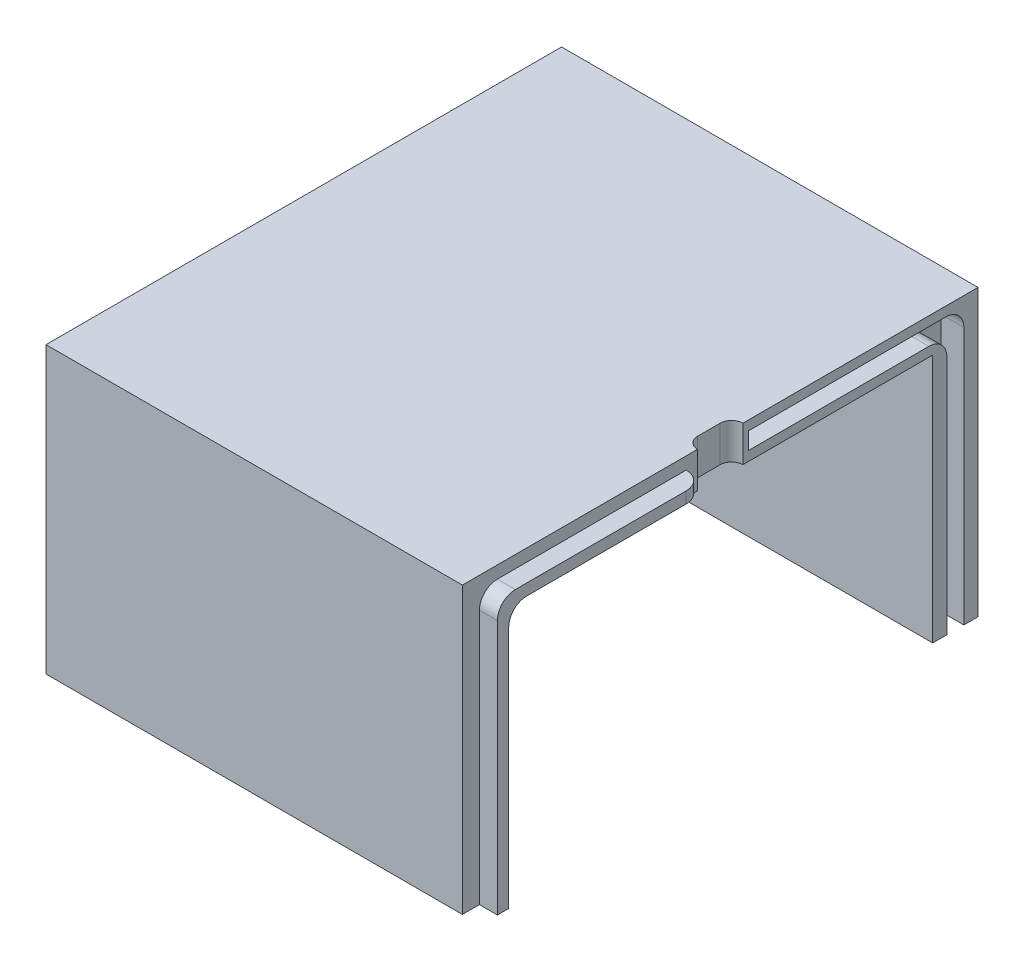
ISO-10303-21;
HEADER;
FILE_DESCRIPTION(('STEP AP214'),'2;1');
FILE_NAME('part.step','',(''),(''),'','','');
FILE_SCHEMA(('AUTOMOTIVE_DESIGN { 1 0 10303 214 1 1 1 1 }'));
ENDSEC;
DATA;
#1=APPLICATION_CONTEXT('core data for automotive mechanical design processes');
#2=APPLICATION_PROTOCOL_DEFINITION('international standard','automotive_design',2000,#1);
#3=PRODUCT_CONTEXT('',#1,'mechanical');
#4=PRODUCT('Part','Part','',(#3));
#5=PRODUCT_RELATED_PRODUCT_CATEGORY('part','',(#4));
#6=PRODUCT_DEFINITION_FORMATION('','',#4);
#7=PRODUCT_DEFINITION_CONTEXT('part definition',#1,'design');
#8=PRODUCT_DEFINITION('design','',#6,#7);
#9=PRODUCT_DEFINITION_SHAPE('','',#8);
#10=(LENGTH_UNIT() NAMED_UNIT(*) SI_UNIT(.MILLI.,.METRE.));
#11=(NAMED_UNIT(*) PLANE_ANGLE_UNIT() SI_UNIT($,.RADIAN.));
#12=(NAMED_UNIT(*) SI_UNIT($,.STERADIAN.) SOLID_ANGLE_UNIT());
#13=UNCERTAINTY_MEASURE_WITH_UNIT(LENGTH_MEASURE(1.E-05),#10,'distance_accuracy_value','');
#14=(GEOMETRIC_REPRESENTATION_CONTEXT(3) GLOBAL_UNCERTAINTY_ASSIGNED_CONTEXT((#13)) GLOBAL_UNIT_ASSIGNED_CONTEXT((#10,
#11,#12)) REPRESENTATION_CONTEXT('',''));
#15=CARTESIAN_POINT('',(0.,0.,0.));
#16=DIRECTION('',(0.,0.,1.));
#17=DIRECTION('',(1.,0.,0.));
#18=AXIS2_PLACEMENT_3D('',#15,#16,#17);
#19=CARTESIAN_POINT('',(0.,22.,0.));
#20=DIRECTION('',(1.,0.,0.));
#21=DIRECTION('',(0.,0.,-1.));
#22=AXIS2_PLACEMENT_3D('',#19,#20,#21);
#23=PLANE('',#22);
#24=DIRECTION('',(0.,-1.,0.));
#25=VECTOR('',#24,1.);
#26=CARTESIAN_POINT('',(0.,0.,2.75));
#27=LINE('',#26,#25);
#28=CARTESIAN_POINT('',(0.,21.25,2.75));
#29=VERTEX_POINT('',#28);
#30=CARTESIAN_POINT('',(0.,0.,2.75));
#31=VERTEX_POINT('',#30);
#32=EDGE_CURVE('E531',#29,#31,#27,.T.);
#33=ORIENTED_EDGE('',*,*,#32,.F.);
#34=CARTESIAN_POINT('',(0.,21.25,4.3375));
#35=DIRECTION('',(1.,0.,0.));
#36=DIRECTION('',(0.,0.,-1.));
#37=AXIS2_PLACEMENT_3D('',#34,#35,#36);
#38=CIRCLE('',#37,1.5875);
#39=CARTESIAN_POINT('',(0.,22.8375,4.3375));
#40=VERTEX_POINT('',#39);
#41=EDGE_CURVE('E430',#29,#40,#38,.T.);
#42=ORIENTED_EDGE('',*,*,#41,.T.);
#43=DIRECTION('',(0.,0.,-1.));
#44=VECTOR('',#43,1.);
#45=CARTESIAN_POINT('',(0.,22.8375,0.));
#46=LINE('',#45,#44);
#47=CARTESIAN_POINT('',(0.,22.8375,20.25));
#48=VERTEX_POINT('',#47);
#49=EDGE_CURVE('E534',#48,#40,#46,.T.);
#50=ORIENTED_EDGE('',*,*,#49,.F.);
#51=DIRECTION('',(0.,1.,0.));
#52=VECTOR('',#51,1.);
#53=CARTESIAN_POINT('',(0.,0.,20.25));
#54=LINE('',#53,#52);
#55=CARTESIAN_POINT('',(0.,24.3375,20.25));
#56=VERTEX_POINT('',#55);
#57=EDGE_CURVE('E539',#48,#56,#54,.T.);
#58=ORIENTED_EDGE('',*,*,#57,.T.);
#59=DIRECTION('',(0.,0.,-1.));
#60=VECTOR('',#59,1.);
#61=CARTESIAN_POINT('',(0.,24.3375,0.));
#62=LINE('',#61,#60);
#63=CARTESIAN_POINT('',(0.,24.3375,2.8375));
#64=VERTEX_POINT('',#63);
#65=EDGE_CURVE('E530',#56,#64,#62,.T.);
#66=ORIENTED_EDGE('',*,*,#65,.T.);
#67=CARTESIAN_POINT('',(0.,22.75,2.8375));
#68=DIRECTION('',(1.,0.,0.));
#69=DIRECTION('',(0.,0.,-1.));
#70=AXIS2_PLACEMENT_3D('',#67,#68,#69);
#71=CIRCLE('',#70,1.5875);
#72=CARTESIAN_POINT('',(0.,22.75,1.25));
#73=VERTEX_POINT('',#72);
#74=EDGE_CURVE('E457',#64,#73,#71,.F.);
#75=ORIENTED_EDGE('',*,*,#74,.T.);
#76=DIRECTION('',(0.,-1.,0.));
#77=VECTOR('',#76,1.);
#78=CARTESIAN_POINT('',(0.,0.,1.25));
#79=LINE('',#78,#77);
#80=CARTESIAN_POINT('',(0.,0.,1.25));
#81=VERTEX_POINT('',#80);
#82=EDGE_CURVE('E528',#73,#81,#79,.T.);
#83=ORIENTED_EDGE('',*,*,#82,.T.);
#84=DIRECTION('',(0.,0.,1.));
#85=VECTOR('',#84,1.);
#86=CARTESIAN_POINT('',(0.,0.,0.));
#87=LINE('',#86,#85);
#88=CARTESIAN_POINT('',(0.,0.,0.));
#89=VERTEX_POINT('',#88);
#90=EDGE_CURVE('E269',#89,#81,#87,.T.);
#91=ORIENTED_EDGE('',*,*,#90,.F.);
#92=DIRECTION('',(0.,-1.,0.));
#93=VECTOR('',#92,1.);
#94=CARTESIAN_POINT('',(0.,22.,0.));
#95=LINE('',#94,#93);
#96=CARTESIAN_POINT('',(0.,25.175,0.));
#97=VERTEX_POINT('',#96);
#98=EDGE_CURVE('E408',#97,#89,#95,.T.);
#99=ORIENTED_EDGE('',*,*,#98,.F.);
#100=DIRECTION('',(0.,0.,-1.));
#101=VECTOR('',#100,1.);
#102=CARTESIAN_POINT('',(0.,25.175,0.));
#103=LINE('',#102,#101);
#104=CARTESIAN_POINT('',(0.,25.175,20.75));
#105=VERTEX_POINT('',#104);
#106=EDGE_CURVE('E324',#105,#97,#103,.T.);
#107=ORIENTED_EDGE('',*,*,#106,.F.);
#108=DIRECTION('',(0.,-1.,0.));
#109=VECTOR('',#108,1.);
#110=CARTESIAN_POINT('',(0.,25.175,20.75));
#111=LINE('',#110,#109);
#112=CARTESIAN_POINT('',(0.,22.,20.75));
#113=VERTEX_POINT('',#112);
#114=EDGE_CURVE('E347',#105,#113,#111,.T.);
#115=ORIENTED_EDGE('',*,*,#114,.T.);
#116=DIRECTION('',(0.,0.,-1.));
#117=VECTOR('',#116,1.);
#118=CARTESIAN_POINT('',(0.,22.,0.));
#119=LINE('',#118,#117);
#120=CARTESIAN_POINT('',(0.,22.,4.));
#121=VERTEX_POINT('',#120);
#122=EDGE_CURVE('E323',#113,#121,#119,.T.);
#123=ORIENTED_EDGE('',*,*,#122,.T.);
#124=DIRECTION('',(0.,-1.,0.));
#125=VECTOR('',#124,1.);
#126=CARTESIAN_POINT('',(0.,22.,4.));
#127=LINE('',#126,#125);
#128=CARTESIAN_POINT('',(0.,0.,4.));
#129=VERTEX_POINT('',#128);
#130=EDGE_CURVE('E410',#121,#129,#127,.T.);
#131=ORIENTED_EDGE('',*,*,#130,.T.);
#132=EDGE_CURVE('E388',#31,#129,#87,.T.);
#133=ORIENTED_EDGE('',*,*,#132,.F.);
#134=EDGE_LOOP('',(#33,#42,#50,#58,#66,#75,#83,#91,#99,#107,#115,#123,#131,#133));
#135=FACE_BOUND('',#134,.T.);
#136=ADVANCED_FACE('F46',(#135),#23,.T.);
#137=CARTESIAN_POINT('',(0.,0.,0.));
#138=DIRECTION('',(0.,1.,0.));
#139=DIRECTION('',(0.,0.,1.));
#140=AXIS2_PLACEMENT_3D('',#137,#138,#139);
#141=PLANE('',#140);
#142=CARTESIAN_POINT('',(-18.375,0.,2.5));
#143=DIRECTION('',(0.,-1.,0.));
#144=DIRECTION('',(0.,0.,-1.));
#145=AXIS2_PLACEMENT_3D('',#142,#143,#144);
#146=CIRCLE('',#145,0.88899999999999);
#147=CARTESIAN_POINT('',(-18.375,0.,1.61100000000001));
#148=VERTEX_POINT('',#147);
#149=EDGE_CURVE('E317',#148,#148,#146,.T.);
#150=ORIENTED_EDGE('',*,*,#149,.F.);
#151=EDGE_LOOP('',(#150));
#152=FACE_BOUND('',#151,.T.);
#153=CARTESIAN_POINT('',(-18.375,0.,43.));
#154=DIRECTION('',(0.,-1.,0.));
#155=DIRECTION('',(0.,0.,-1.));
#156=AXIS2_PLACEMENT_3D('',#153,#154,#155);
#157=CIRCLE('',#156,0.88899999999999);
#158=CARTESIAN_POINT('',(-18.375,0.,42.111));
#159=VERTEX_POINT('',#158);
#160=EDGE_CURVE('E311',#159,#159,#157,.T.);
#161=ORIENTED_EDGE('',*,*,#160,.F.);
#162=EDGE_LOOP('',(#161));
#163=FACE_BOUND('',#162,.T.);
#164=DIRECTION('',(1.,0.,0.));
#165=VECTOR('',#164,1.);
#166=CARTESIAN_POINT('',(-2.,0.,1.25));
#167=LINE('',#166,#165);
#168=CARTESIAN_POINT('',(-2.,0.,1.25));
#169=VERTEX_POINT('',#168);
#170=EDGE_CURVE('E249',#169,#81,#167,.T.);
#171=ORIENTED_EDGE('',*,*,#170,.F.);
#172=DIRECTION('',(0.,0.,-1.));
#173=VECTOR('',#172,1.);
#174=CARTESIAN_POINT('',(-2.,0.,0.));
#175=LINE('',#174,#173);
#176=CARTESIAN_POINT('',(-2.,0.,2.75));
#177=VERTEX_POINT('',#176);
#178=EDGE_CURVE('E256',#177,#169,#175,.T.);
#179=ORIENTED_EDGE('',*,*,#178,.F.);
#180=DIRECTION('',(1.,0.,0.));
#181=VECTOR('',#180,1.);
#182=CARTESIAN_POINT('',(-2.,0.,2.75));
#183=LINE('',#182,#181);
#184=EDGE_CURVE('E271',#177,#31,#183,.T.);
#185=ORIENTED_EDGE('',*,*,#184,.T.);
#186=ORIENTED_EDGE('',*,*,#132,.T.);
#187=DIRECTION('',(-1.,0.,0.));
#188=VECTOR('',#187,1.);
#189=CARTESIAN_POINT('',(0.,0.,4.));
#190=LINE('',#189,#188);
#191=CARTESIAN_POINT('',(-32.75,0.,4.));
#192=VERTEX_POINT('',#191);
#193=EDGE_CURVE('E385',#129,#192,#190,.T.);
#194=ORIENTED_EDGE('',*,*,#193,.T.);
#195=DIRECTION('',(0.,0.,1.));
#196=VECTOR('',#195,1.);
#197=CARTESIAN_POINT('',(-32.75,0.,0.));
#198=LINE('',#197,#196);
#199=CARTESIAN_POINT('',(-32.75,0.,41.5));
#200=VERTEX_POINT('',#199);
#201=EDGE_CURVE('E382',#192,#200,#198,.T.);
#202=ORIENTED_EDGE('',*,*,#201,.T.);
#203=DIRECTION('',(1.,0.,0.));
#204=VECTOR('',#203,1.);
#205=CARTESIAN_POINT('',(0.,0.,41.5));
#206=LINE('',#205,#204);
#207=CARTESIAN_POINT('',(0.,0.,41.5));
#208=VERTEX_POINT('',#207);
#209=EDGE_CURVE('E368',#200,#208,#206,.T.);
#210=ORIENTED_EDGE('',*,*,#209,.T.);
#211=CARTESIAN_POINT('',(0.,0.,43.));
#212=VERTEX_POINT('',#211);
#213=EDGE_CURVE('E373',#208,#212,#87,.T.);
#214=ORIENTED_EDGE('',*,*,#213,.T.);
#215=DIRECTION('',(-1.,0.,0.));
#216=VECTOR('',#215,1.);
#217=CARTESIAN_POINT('',(1.5875,0.,43.));
#218=LINE('',#217,#216);
#219=CARTESIAN_POINT('',(1.5875,0.,43.));
#220=VERTEX_POINT('',#219);
#221=EDGE_CURVE('E293',#220,#212,#218,.T.);
#222=ORIENTED_EDGE('',*,*,#221,.F.);
#223=DIRECTION('',(0.,0.,-1.));
#224=VECTOR('',#223,1.);
#225=CARTESIAN_POINT('',(1.5875,0.,0.));
#226=LINE('',#225,#224);
#227=CARTESIAN_POINT('',(1.5875,0.,44.));
#228=VERTEX_POINT('',#227);
#229=EDGE_CURVE('E286',#228,#220,#226,.T.);
#230=ORIENTED_EDGE('',*,*,#229,.F.);
#231=DIRECTION('',(-1.,0.,0.));
#232=VECTOR('',#231,1.);
#233=CARTESIAN_POINT('',(1.5875,0.,44.));
#234=LINE('',#233,#232);
#235=CARTESIAN_POINT('',(0.,0.,44.));
#236=VERTEX_POINT('',#235);
#237=EDGE_CURVE('E308',#228,#236,#234,.T.);
#238=ORIENTED_EDGE('',*,*,#237,.T.);
#239=CARTESIAN_POINT('',(0.,0.,45.5));
#240=VERTEX_POINT('',#239);
#241=EDGE_CURVE('E398',#236,#240,#87,.T.);
#242=ORIENTED_EDGE('',*,*,#241,.T.);
#243=DIRECTION('',(-1.,0.,0.));
#244=VECTOR('',#243,1.);
#245=CARTESIAN_POINT('',(0.,0.,45.5));
#246=LINE('',#245,#244);
#247=CARTESIAN_POINT('',(-36.75,0.,45.5));
#248=VERTEX_POINT('',#247);
#249=EDGE_CURVE('E395',#240,#248,#246,.T.);
#250=ORIENTED_EDGE('',*,*,#249,.T.);
#251=DIRECTION('',(0.,0.,1.));
#252=VECTOR('',#251,1.);
#253=CARTESIAN_POINT('',(-36.75,0.,0.));
#254=LINE('',#253,#252);
#255=CARTESIAN_POINT('',(-36.75,0.,0.));
#256=VERTEX_POINT('',#255);
#257=EDGE_CURVE('E392',#256,#248,#254,.T.);
#258=ORIENTED_EDGE('',*,*,#257,.F.);
#259=DIRECTION('',(-1.,0.,0.));
#260=VECTOR('',#259,1.);
#261=CARTESIAN_POINT('',(0.,0.,0.));
#262=LINE('',#261,#260);
#263=EDGE_CURVE('E390',#89,#256,#262,.T.);
#264=ORIENTED_EDGE('',*,*,#263,.F.);
#265=ORIENTED_EDGE('',*,*,#90,.T.);
#266=EDGE_LOOP('',(#171,#179,#185,#186,#194,#202,#210,#214,#222,#230,#238,#242,#250,#258,#264,#265));
#267=FACE_BOUND('',#266,.T.);
#268=ADVANCED_FACE('F266',(#152,#163,#267),#141,.F.);
#269=CARTESIAN_POINT('',(0.,22.,41.5));
#270=DIRECTION('',(0.,0.,-1.));
#271=DIRECTION('',(-1.,0.,0.));
#272=AXIS2_PLACEMENT_3D('',#269,#270,#271);
#273=PLANE('',#272);
#274=ORIENTED_EDGE('',*,*,#209,.F.);
#275=DIRECTION('',(0.,-1.,0.));
#276=VECTOR('',#275,1.);
#277=CARTESIAN_POINT('',(-32.75,22.,41.5));
#278=LINE('',#277,#276);
#279=CARTESIAN_POINT('',(-32.75,22.,41.5));
#280=VERTEX_POINT('',#279);
#281=EDGE_CURVE('E415',#280,#200,#278,.T.);
#282=ORIENTED_EDGE('',*,*,#281,.F.);
#283=DIRECTION('',(1.,0.,0.));
#284=VECTOR('',#283,1.);
#285=CARTESIAN_POINT('',(0.,22.,41.5));
#286=LINE('',#285,#284);
#287=CARTESIAN_POINT('',(0.,22.,41.5));
#288=VERTEX_POINT('',#287);
#289=EDGE_CURVE('E369',#280,#288,#286,.T.);
#290=ORIENTED_EDGE('',*,*,#289,.T.);
#291=DIRECTION('',(0.,-1.,0.));
#292=VECTOR('',#291,1.);
#293=CARTESIAN_POINT('',(0.,22.,41.5));
#294=LINE('',#293,#292);
#295=EDGE_CURVE('E379',#288,#208,#294,.T.);
#296=ORIENTED_EDGE('',*,*,#295,.T.);
#297=EDGE_LOOP('',(#274,#282,#290,#296));
#298=FACE_BOUND('',#297,.T.);
#299=ADVANCED_FACE('F498',(#298),#273,.T.);
#300=CARTESIAN_POINT('',(-32.75,22.,0.));
#301=DIRECTION('',(1.,0.,0.));
#302=DIRECTION('',(0.,0.,-1.));
#303=AXIS2_PLACEMENT_3D('',#300,#301,#302);
#304=PLANE('',#303);
#305=ORIENTED_EDGE('',*,*,#201,.F.);
#306=DIRECTION('',(0.,-1.,0.));
#307=VECTOR('',#306,1.);
#308=CARTESIAN_POINT('',(-32.75,22.,4.));
#309=LINE('',#308,#307);
#310=CARTESIAN_POINT('',(-32.75,22.,4.));
#311=VERTEX_POINT('',#310);
#312=EDGE_CURVE('E413',#311,#192,#309,.T.);
#313=ORIENTED_EDGE('',*,*,#312,.F.);
#314=DIRECTION('',(0.,0.,1.));
#315=VECTOR('',#314,1.);
#316=CARTESIAN_POINT('',(-32.75,22.,0.));
#317=LINE('',#316,#315);
#318=EDGE_CURVE('E372',#311,#280,#317,.T.);
#319=ORIENTED_EDGE('',*,*,#318,.T.);
#320=ORIENTED_EDGE('',*,*,#281,.T.);
#321=EDGE_LOOP('',(#305,#313,#319,#320));
#322=FACE_BOUND('',#321,.T.);
#323=ADVANCED_FACE('F495',(#322),#304,.T.);
#324=CARTESIAN_POINT('',(0.,22.,4.));
#325=DIRECTION('',(0.,0.,1.));
#326=DIRECTION('',(1.,0.,0.));
#327=AXIS2_PLACEMENT_3D('',#324,#325,#326);
#328=PLANE('',#327);
#329=ORIENTED_EDGE('',*,*,#193,.F.);
#330=ORIENTED_EDGE('',*,*,#130,.F.);
#331=DIRECTION('',(-1.,0.,0.));
#332=VECTOR('',#331,1.);
#333=CARTESIAN_POINT('',(0.,22.,4.));
#334=LINE('',#333,#332);
#335=EDGE_CURVE('E376',#121,#311,#334,.T.);
#336=ORIENTED_EDGE('',*,*,#335,.T.);
#337=ORIENTED_EDGE('',*,*,#312,.T.);
#338=EDGE_LOOP('',(#329,#330,#336,#337));
#339=FACE_BOUND('',#338,.T.);
#340=ADVANCED_FACE('F491',(#339),#328,.T.);
#341=CARTESIAN_POINT('',(0.,22.,0.));
#342=DIRECTION('',(0.,0.,1.));
#343=DIRECTION('',(1.,0.,0.));
#344=AXIS2_PLACEMENT_3D('',#341,#342,#343);
#345=PLANE('',#344);
#346=ORIENTED_EDGE('',*,*,#263,.T.);
#347=DIRECTION('',(0.,-1.,0.));
#348=VECTOR('',#347,1.);
#349=CARTESIAN_POINT('',(-36.75,22.,0.));
#350=LINE('',#349,#348);
#351=CARTESIAN_POINT('',(-36.75,25.175,0.));
#352=VERTEX_POINT('',#351);
#353=EDGE_CURVE('E405',#352,#256,#350,.T.);
#354=ORIENTED_EDGE('',*,*,#353,.F.);
#355=DIRECTION('',(1.,0.,0.));
#356=VECTOR('',#355,1.);
#357=CARTESIAN_POINT('',(0.,25.175,0.));
#358=LINE('',#357,#356);
#359=EDGE_CURVE('E327',#352,#97,#358,.T.);
#360=ORIENTED_EDGE('',*,*,#359,.T.);
#361=ORIENTED_EDGE('',*,*,#98,.T.);
#362=EDGE_LOOP('',(#346,#354,#360,#361));
#363=FACE_BOUND('',#362,.T.);
#364=ADVANCED_FACE('F526',(#363),#345,.F.);
#365=CARTESIAN_POINT('',(-36.75,22.,0.));
#366=DIRECTION('',(1.,0.,0.));
#367=DIRECTION('',(0.,0.,-1.));
#368=AXIS2_PLACEMENT_3D('',#365,#366,#367);
#369=PLANE('',#368);
#370=ORIENTED_EDGE('',*,*,#257,.T.);
#371=DIRECTION('',(0.,-1.,0.));
#372=VECTOR('',#371,1.);
#373=CARTESIAN_POINT('',(-36.75,22.,45.5));
#374=LINE('',#373,#372);
#375=CARTESIAN_POINT('',(-36.75,25.175,45.5));
#376=VERTEX_POINT('',#375);
#377=EDGE_CURVE('E403',#376,#248,#374,.T.);
#378=ORIENTED_EDGE('',*,*,#377,.F.);
#379=DIRECTION('',(0.,0.,-1.));
#380=VECTOR('',#379,1.);
#381=CARTESIAN_POINT('',(-36.75,25.175,0.));
#382=LINE('',#381,#380);
#383=EDGE_CURVE('E331',#376,#352,#382,.T.);
#384=ORIENTED_EDGE('',*,*,#383,.T.);
#385=ORIENTED_EDGE('',*,*,#353,.T.);
#386=EDGE_LOOP('',(#370,#378,#384,#385));
#387=FACE_BOUND('',#386,.T.);
#388=ADVANCED_FACE('F523',(#387),#369,.F.);
#389=CARTESIAN_POINT('',(0.,22.,45.5));
#390=DIRECTION('',(0.,0.,1.));
#391=DIRECTION('',(1.,0.,0.));
#392=AXIS2_PLACEMENT_3D('',#389,#390,#391);
#393=PLANE('',#392);
#394=ORIENTED_EDGE('',*,*,#249,.F.);
#395=DIRECTION('',(0.,-1.,0.));
#396=VECTOR('',#395,1.);
#397=CARTESIAN_POINT('',(0.,22.,45.5));
#398=LINE('',#397,#396);
#399=CARTESIAN_POINT('',(0.,25.175,45.5));
#400=VERTEX_POINT('',#399);
#401=EDGE_CURVE('E400',#400,#240,#398,.T.);
#402=ORIENTED_EDGE('',*,*,#401,.F.);
#403=DIRECTION('',(1.,0.,0.));
#404=VECTOR('',#403,1.);
#405=CARTESIAN_POINT('',(0.,25.175,45.5));
#406=LINE('',#405,#404);
#407=EDGE_CURVE('E334',#376,#400,#406,.T.);
#408=ORIENTED_EDGE('',*,*,#407,.F.);
#409=ORIENTED_EDGE('',*,*,#377,.T.);
#410=EDGE_LOOP('',(#394,#402,#408,#409));
#411=FACE_BOUND('',#410,.T.);
#412=ADVANCED_FACE('F520',(#411),#393,.T.);
#413=DIRECTION('',(0.,0.,-1.));
#414=VECTOR('',#413,1.);
#415=CARTESIAN_POINT('',(0.,23.0875,0.));
#416=LINE('',#415,#414);
#417=CARTESIAN_POINT('',(0.,23.0875,41.4125));
#418=VERTEX_POINT('',#417);
#419=CARTESIAN_POINT('',(0.,23.0875,25.75));
#420=VERTEX_POINT('',#419);
#421=EDGE_CURVE('E283',#418,#420,#416,.T.);
#422=ORIENTED_EDGE('',*,*,#421,.F.);
#423=CARTESIAN_POINT('',(0.,21.5,41.4125));
#424=DIRECTION('',(1.,0.,0.));
#425=DIRECTION('',(0.,0.,-1.));
#426=AXIS2_PLACEMENT_3D('',#423,#424,#425);
#427=CIRCLE('',#426,1.5875);
#428=CARTESIAN_POINT('',(0.,21.5,43.));
#429=VERTEX_POINT('',#428);
#430=EDGE_CURVE('E444',#418,#429,#427,.T.);
#431=ORIENTED_EDGE('',*,*,#430,.T.);
#432=DIRECTION('',(0.,1.,0.));
#433=VECTOR('',#432,1.);
#434=CARTESIAN_POINT('',(0.,0.,43.));
#435=LINE('',#434,#433);
#436=EDGE_CURVE('E302',#212,#429,#435,.T.);
#437=ORIENTED_EDGE('',*,*,#436,.F.);
#438=ORIENTED_EDGE('',*,*,#213,.F.);
#439=ORIENTED_EDGE('',*,*,#295,.F.);
#440=DIRECTION('',(0.,0.,-1.));
#441=VECTOR('',#440,1.);
#442=CARTESIAN_POINT('',(0.,22.,0.));
#443=LINE('',#442,#441);
#444=CARTESIAN_POINT('',(0.,22.,24.75));
#445=VERTEX_POINT('',#444);
#446=EDGE_CURVE('E350',#288,#445,#443,.T.);
#447=ORIENTED_EDGE('',*,*,#446,.T.);
#448=DIRECTION('',(0.,-1.,0.));
#449=VECTOR('',#448,1.);
#450=CARTESIAN_POINT('',(0.,25.175,24.75));
#451=LINE('',#450,#449);
#452=CARTESIAN_POINT('',(0.,25.175,24.75));
#453=VERTEX_POINT('',#452);
#454=EDGE_CURVE('E365',#453,#445,#451,.T.);
#455=ORIENTED_EDGE('',*,*,#454,.F.);
#456=DIRECTION('',(0.,0.,-1.));
#457=VECTOR('',#456,1.);
#458=CARTESIAN_POINT('',(0.,25.175,0.));
#459=LINE('',#458,#457);
#460=EDGE_CURVE('E337',#400,#453,#459,.T.);
#461=ORIENTED_EDGE('',*,*,#460,.F.);
#462=ORIENTED_EDGE('',*,*,#401,.T.);
#463=ORIENTED_EDGE('',*,*,#241,.F.);
#464=DIRECTION('',(0.,1.,0.));
#465=VECTOR('',#464,1.);
#466=CARTESIAN_POINT('',(0.,0.,44.));
#467=LINE('',#466,#465);
#468=CARTESIAN_POINT('',(0.,22.5,44.));
#469=VERTEX_POINT('',#468);
#470=EDGE_CURVE('E299',#236,#469,#467,.T.);
#471=ORIENTED_EDGE('',*,*,#470,.T.);
#472=CARTESIAN_POINT('',(0.,22.5,42.4125));
#473=DIRECTION('',(1.,0.,0.));
#474=DIRECTION('',(0.,0.,-1.));
#475=AXIS2_PLACEMENT_3D('',#472,#473,#474);
#476=CIRCLE('',#475,1.5875);
#477=CARTESIAN_POINT('',(0.,24.0875,42.4125));
#478=VERTEX_POINT('',#477);
#479=EDGE_CURVE('E11',#469,#478,#476,.F.);
#480=ORIENTED_EDGE('',*,*,#479,.T.);
#481=DIRECTION('',(0.,0.,-1.));
#482=VECTOR('',#481,1.);
#483=CARTESIAN_POINT('',(0.,24.0875,0.));
#484=LINE('',#483,#482);
#485=CARTESIAN_POINT('',(0.,24.0875,25.75));
#486=VERTEX_POINT('',#485);
#487=EDGE_CURVE('E296',#478,#486,#484,.T.);
#488=ORIENTED_EDGE('',*,*,#487,.T.);
#489=DIRECTION('',(0.,-1.,0.));
#490=VECTOR('',#489,1.);
#491=CARTESIAN_POINT('',(0.,0.,25.75));
#492=LINE('',#491,#490);
#493=EDGE_CURVE('E273',#486,#420,#492,.T.);
#494=ORIENTED_EDGE('',*,*,#493,.T.);
#495=EDGE_LOOP('',(#422,#431,#437,#438,#439,#447,#455,#461,#462,#463,#471,#480,#488,#494));
#496=FACE_BOUND('',#495,.T.);
#497=ADVANCED_FACE('F473',(#496),#23,.T.);
#498=CARTESIAN_POINT('',(0.,25.175,23.75));
#499=DIRECTION('',(0.,-1.,0.));
#500=DIRECTION('',(0.,0.,-1.));
#501=AXIS2_PLACEMENT_3D('',#498,#499,#500);
#502=CYLINDRICAL_SURFACE('',#501,0.999999999999995);
#503=CARTESIAN_POINT('',(0.,22.,23.75));
#504=DIRECTION('',(0.,1.,0.));
#505=DIRECTION('',(0.,0.,1.));
#506=AXIS2_PLACEMENT_3D('',#503,#504,#505);
#507=CIRCLE('',#506,0.999999999999995);
#508=CARTESIAN_POINT('',(-0.999999999999992,22.,23.75));
#509=VERTEX_POINT('',#508);
#510=EDGE_CURVE('E352',#509,#445,#507,.T.);
#511=ORIENTED_EDGE('',*,*,#510,.F.);
#512=DIRECTION('',(0.,-1.,0.));
#513=VECTOR('',#512,1.);
#514=CARTESIAN_POINT('',(-0.999999999999992,25.175,23.75));
#515=LINE('',#514,#513);
#516=CARTESIAN_POINT('',(-0.999999999999992,25.175,23.75));
#517=VERTEX_POINT('',#516);
#518=EDGE_CURVE('E363',#517,#509,#515,.T.);
#519=ORIENTED_EDGE('',*,*,#518,.F.);
#520=CARTESIAN_POINT('',(0.,25.175,23.75));
#521=DIRECTION('',(0.,1.,0.));
#522=DIRECTION('',(0.,0.,1.));
#523=AXIS2_PLACEMENT_3D('',#520,#521,#522);
#524=CIRCLE('',#523,0.999999999999995);
#525=EDGE_CURVE('E339',#517,#453,#524,.T.);
#526=ORIENTED_EDGE('',*,*,#525,.T.);
#527=ORIENTED_EDGE('',*,*,#454,.T.);
#528=EDGE_LOOP('',(#511,#519,#526,#527));
#529=FACE_BOUND('',#528,.T.);
#530=ADVANCED_FACE('F504',(#529),#502,.F.);
#531=CARTESIAN_POINT('',(-0.999999999999997,25.175,0.));
#532=DIRECTION('',(-1.,0.,0.));
#533=DIRECTION('',(0.,0.,1.));
#534=AXIS2_PLACEMENT_3D('',#531,#532,#533);
#535=PLANE('',#534);
#536=DIRECTION('',(0.,0.,-1.));
#537=VECTOR('',#536,1.);
#538=CARTESIAN_POINT('',(-0.999999999999997,22.,0.));
#539=LINE('',#538,#537);
#540=CARTESIAN_POINT('',(-0.999999999999998,22.,21.75));
#541=VERTEX_POINT('',#540);
#542=EDGE_CURVE('E355',#509,#541,#539,.T.);
#543=ORIENTED_EDGE('',*,*,#542,.T.);
#544=DIRECTION('',(0.,-1.,0.));
#545=VECTOR('',#544,1.);
#546=CARTESIAN_POINT('',(-0.999999999999998,25.175,21.75));
#547=LINE('',#546,#545);
#548=CARTESIAN_POINT('',(-0.999999999999998,25.175,21.75));
#549=VERTEX_POINT('',#548);
#550=EDGE_CURVE('E361',#549,#541,#547,.T.);
#551=ORIENTED_EDGE('',*,*,#550,.F.);
#552=DIRECTION('',(0.,0.,-1.));
#553=VECTOR('',#552,1.);
#554=CARTESIAN_POINT('',(-0.999999999999997,25.175,0.));
#555=LINE('',#554,#553);
#556=EDGE_CURVE('E342',#517,#549,#555,.T.);
#557=ORIENTED_EDGE('',*,*,#556,.F.);
#558=ORIENTED_EDGE('',*,*,#518,.T.);
#559=EDGE_LOOP('',(#543,#551,#557,#558));
#560=FACE_BOUND('',#559,.T.);
#561=ADVANCED_FACE('F511',(#560),#535,.F.);
#562=CARTESIAN_POINT('',(0.,25.175,21.75));
#563=DIRECTION('',(0.,-1.,0.));
#564=DIRECTION('',(0.,0.,-1.));
#565=AXIS2_PLACEMENT_3D('',#562,#563,#564);
#566=CYLINDRICAL_SURFACE('',#565,0.999999999999995);
#567=CARTESIAN_POINT('',(0.,22.,21.75));
#568=DIRECTION('',(0.,1.,0.));
#569=DIRECTION('',(0.,0.,1.));
#570=AXIS2_PLACEMENT_3D('',#567,#568,#569);
#571=CIRCLE('',#570,0.999999999999995);
#572=EDGE_CURVE('E328',#113,#541,#571,.T.);
#573=ORIENTED_EDGE('',*,*,#572,.F.);
#574=ORIENTED_EDGE('',*,*,#114,.F.);
#575=CARTESIAN_POINT('',(0.,25.175,21.75));
#576=DIRECTION('',(0.,1.,0.));
#577=DIRECTION('',(0.,0.,1.));
#578=AXIS2_PLACEMENT_3D('',#575,#576,#577);
#579=CIRCLE('',#578,0.999999999999995);
#580=EDGE_CURVE('E344',#105,#549,#579,.T.);
#581=ORIENTED_EDGE('',*,*,#580,.T.);
#582=ORIENTED_EDGE('',*,*,#550,.T.);
#583=EDGE_LOOP('',(#573,#574,#581,#582));
#584=FACE_BOUND('',#583,.T.);
#585=ADVANCED_FACE('F659',(#584),#566,.F.);
#586=CARTESIAN_POINT('',(0.,25.175,23.75));
#587=DIRECTION('',(0.,1.,0.));
#588=DIRECTION('',(0.,0.,1.));
#589=AXIS2_PLACEMENT_3D('',#586,#587,#588);
#590=PLANE('',#589);
#591=ORIENTED_EDGE('',*,*,#106,.T.);
#592=ORIENTED_EDGE('',*,*,#359,.F.);
#593=ORIENTED_EDGE('',*,*,#383,.F.);
#594=ORIENTED_EDGE('',*,*,#407,.T.);
#595=ORIENTED_EDGE('',*,*,#460,.T.);
#596=ORIENTED_EDGE('',*,*,#525,.F.);
#597=ORIENTED_EDGE('',*,*,#556,.T.);
#598=ORIENTED_EDGE('',*,*,#580,.F.);
#599=EDGE_LOOP('',(#591,#592,#593,#594,#595,#596,#597,#598));
#600=FACE_BOUND('',#599,.T.);
#601=ADVANCED_FACE('F515',(#600),#590,.T.);
#602=CARTESIAN_POINT('',(0.,22.,23.75));
#603=DIRECTION('',(0.,1.,0.));
#604=DIRECTION('',(0.,0.,1.));
#605=AXIS2_PLACEMENT_3D('',#602,#603,#604);
#606=PLANE('',#605);
#607=ORIENTED_EDGE('',*,*,#289,.F.);
#608=ORIENTED_EDGE('',*,*,#318,.F.);
#609=ORIENTED_EDGE('',*,*,#335,.F.);
#610=ORIENTED_EDGE('',*,*,#122,.F.);
#611=ORIENTED_EDGE('',*,*,#572,.T.);
#612=ORIENTED_EDGE('',*,*,#542,.F.);
#613=ORIENTED_EDGE('',*,*,#510,.T.);
#614=ORIENTED_EDGE('',*,*,#446,.F.);
#615=EDGE_LOOP('',(#607,#608,#609,#610,#611,#612,#613,#614));
#616=FACE_BOUND('',#615,.T.);
#617=ADVANCED_FACE('F507',(#616),#606,.F.);
#618=CARTESIAN_POINT('',(-18.375,5.73,2.5));
#619=DIRECTION('',(0.,-1.,0.));
#620=DIRECTION('',(0.,0.,-1.));
#621=AXIS2_PLACEMENT_3D('',#618,#619,#620);
#622=CONICAL_SURFACE('',#621,0.888999999999997,1.02974425867665);
#623=CARTESIAN_POINT('',(-18.375,6.2641650903155,2.5));
#624=VERTEX_POINT('',#623);
#625=VERTEX_LOOP('',#624);
#626=FACE_BOUND('',#625,.T.);
#627=CARTESIAN_POINT('',(-18.375,5.73,2.5));
#628=DIRECTION('',(0.,-1.,0.));
#629=DIRECTION('',(0.,0.,-1.));
#630=AXIS2_PLACEMENT_3D('',#627,#628,#629);
#631=CIRCLE('',#630,0.888999999999997);
#632=CARTESIAN_POINT('',(-18.375,5.73,1.61100000000001));
#633=VERTEX_POINT('',#632);
#634=EDGE_CURVE('E320',#633,#633,#631,.T.);
#635=ORIENTED_EDGE('',*,*,#634,.T.);
#636=EDGE_LOOP('',(#635));
#637=FACE_BOUND('',#636,.T.);
#638=ADVANCED_FACE('F652',(#626,#637),#622,.F.);
#639=CARTESIAN_POINT('',(-18.375,0.,2.5));
#640=DIRECTION('',(0.,-1.,0.));
#641=DIRECTION('',(0.,0.,-1.));
#642=AXIS2_PLACEMENT_3D('',#639,#640,#641);
#643=CYLINDRICAL_SURFACE('',#642,0.888999999999994);
#644=ORIENTED_EDGE('',*,*,#634,.F.);
#645=EDGE_LOOP('',(#644));
#646=FACE_BOUND('',#645,.T.);
#647=ORIENTED_EDGE('',*,*,#149,.T.);
#648=EDGE_LOOP('',(#647));
#649=FACE_BOUND('',#648,.T.);
#650=ADVANCED_FACE('F648',(#646,#649),#643,.F.);
#651=CARTESIAN_POINT('',(-18.375,5.73,43.));
#652=DIRECTION('',(0.,-1.,0.));
#653=DIRECTION('',(0.,0.,-1.));
#654=AXIS2_PLACEMENT_3D('',#651,#652,#653);
#655=CONICAL_SURFACE('',#654,0.888999999999997,1.02974425867665);
#656=CARTESIAN_POINT('',(-18.375,6.2641650903155,43.));
#657=VERTEX_POINT('',#656);
#658=VERTEX_LOOP('',#657);
#659=FACE_BOUND('',#658,.T.);
#660=CARTESIAN_POINT('',(-18.375,5.73,43.));
#661=DIRECTION('',(0.,-1.,0.));
#662=DIRECTION('',(0.,0.,-1.));
#663=AXIS2_PLACEMENT_3D('',#660,#661,#662);
#664=CIRCLE('',#663,0.888999999999997);
#665=CARTESIAN_POINT('',(-18.375,5.73,42.111));
#666=VERTEX_POINT('',#665);
#667=EDGE_CURVE('E314',#666,#666,#664,.T.);
#668=ORIENTED_EDGE('',*,*,#667,.T.);
#669=EDGE_LOOP('',(#668));
#670=FACE_BOUND('',#669,.T.);
#671=ADVANCED_FACE('F644',(#659,#670),#655,.F.);
#672=CARTESIAN_POINT('',(-18.375,0.,43.));
#673=DIRECTION('',(0.,-1.,0.));
#674=DIRECTION('',(0.,0.,-1.));
#675=AXIS2_PLACEMENT_3D('',#672,#673,#674);
#676=CYLINDRICAL_SURFACE('',#675,0.888999999999994);
#677=ORIENTED_EDGE('',*,*,#667,.F.);
#678=EDGE_LOOP('',(#677));
#679=FACE_BOUND('',#678,.T.);
#680=ORIENTED_EDGE('',*,*,#160,.T.);
#681=EDGE_LOOP('',(#680));
#682=FACE_BOUND('',#681,.T.);
#683=ADVANCED_FACE('F641',(#679,#682),#676,.F.);
#684=CARTESIAN_POINT('',(1.5875,24.0875,0.));
#685=DIRECTION('',(0.,1.,0.));
#686=DIRECTION('',(0.,0.,1.));
#687=AXIS2_PLACEMENT_3D('',#684,#685,#686);
#688=PLANE('',#687);
#689=ORIENTED_EDGE('',*,*,#487,.F.);
#690=DIRECTION('',(-1.,0.,0.));
#691=VECTOR('',#690,1.);
#692=CARTESIAN_POINT('',(1.5875,24.0875,42.4125));
#693=LINE('',#692,#691);
#694=CARTESIAN_POINT('',(1.5875,24.0875,42.4125));
#695=VERTEX_POINT('',#694);
#696=EDGE_CURVE('E68',#478,#695,#693,.F.);
#697=ORIENTED_EDGE('',*,*,#696,.T.);
#698=DIRECTION('',(0.,0.,-1.));
#699=VECTOR('',#698,1.);
#700=CARTESIAN_POINT('',(1.5875,24.0875,0.));
#701=LINE('',#700,#699);
#702=CARTESIAN_POINT('',(1.5875,24.0875,27.3375));
#703=VERTEX_POINT('',#702);
#704=EDGE_CURVE('E280',#695,#703,#701,.T.);
#705=ORIENTED_EDGE('',*,*,#704,.T.);
#706=CARTESIAN_POINT('',(0.,24.0875,27.3375));
#707=DIRECTION('',(0.,1.,0.));
#708=DIRECTION('',(0.,0.,1.));
#709=AXIS2_PLACEMENT_3D('',#706,#707,#708);
#710=CIRCLE('',#709,1.5875);
#711=EDGE_CURVE('E451',#703,#486,#710,.T.);
#712=ORIENTED_EDGE('',*,*,#711,.T.);
#713=EDGE_LOOP('',(#689,#697,#705,#712));
#714=FACE_BOUND('',#713,.T.);
#715=ADVANCED_FACE('F637',(#714),#688,.T.);
#716=CARTESIAN_POINT('',(1.5875,0.,44.));
#717=DIRECTION('',(0.,0.,1.));
#718=DIRECTION('',(1.,0.,0.));
#719=AXIS2_PLACEMENT_3D('',#716,#717,#718);
#720=PLANE('',#719);
#721=DIRECTION('',(0.,1.,0.));
#722=VECTOR('',#721,1.);
#723=CARTESIAN_POINT('',(1.5875,0.,44.));
#724=LINE('',#723,#722);
#725=CARTESIAN_POINT('',(1.5875,22.5,44.));
#726=VERTEX_POINT('',#725);
#727=EDGE_CURVE('E282',#228,#726,#724,.T.);
#728=ORIENTED_EDGE('',*,*,#727,.T.);
#729=DIRECTION('',(-1.,0.,0.));
#730=VECTOR('',#729,1.);
#731=CARTESIAN_POINT('',(1.5875,22.5,44.));
#732=LINE('',#731,#730);
#733=EDGE_CURVE('E448',#726,#469,#732,.T.);
#734=ORIENTED_EDGE('',*,*,#733,.T.);
#735=ORIENTED_EDGE('',*,*,#470,.F.);
#736=ORIENTED_EDGE('',*,*,#237,.F.);
#737=EDGE_LOOP('',(#728,#734,#735,#736));
#738=FACE_BOUND('',#737,.T.);
#739=ADVANCED_FACE('F634',(#738),#720,.T.);
#740=CARTESIAN_POINT('',(1.5875,0.,43.));
#741=DIRECTION('',(0.,0.,1.));
#742=DIRECTION('',(1.,0.,0.));
#743=AXIS2_PLACEMENT_3D('',#740,#741,#742);
#744=PLANE('',#743);
#745=ORIENTED_EDGE('',*,*,#436,.T.);
#746=DIRECTION('',(-1.,0.,0.));
#747=VECTOR('',#746,1.);
#748=CARTESIAN_POINT('',(1.5875,21.5,43.));
#749=LINE('',#748,#747);
#750=CARTESIAN_POINT('',(1.5875,21.5,43.));
#751=VERTEX_POINT('',#750);
#752=EDGE_CURVE('E446',#429,#751,#749,.F.);
#753=ORIENTED_EDGE('',*,*,#752,.T.);
#754=DIRECTION('',(0.,1.,0.));
#755=VECTOR('',#754,1.);
#756=CARTESIAN_POINT('',(1.5875,0.,43.));
#757=LINE('',#756,#755);
#758=EDGE_CURVE('E288',#220,#751,#757,.T.);
#759=ORIENTED_EDGE('',*,*,#758,.F.);
#760=ORIENTED_EDGE('',*,*,#221,.T.);
#761=EDGE_LOOP('',(#745,#753,#759,#760));
#762=FACE_BOUND('',#761,.T.);
#763=ADVANCED_FACE('F477',(#762),#744,.F.);
#764=CARTESIAN_POINT('',(1.5875,23.0875,0.));
#765=DIRECTION('',(0.,1.,0.));
#766=DIRECTION('',(0.,0.,1.));
#767=AXIS2_PLACEMENT_3D('',#764,#765,#766);
#768=PLANE('',#767);
#769=DIRECTION('',(0.,0.,-1.));
#770=VECTOR('',#769,1.);
#771=CARTESIAN_POINT('',(1.5875,23.0875,0.));
#772=LINE('',#771,#770);
#773=CARTESIAN_POINT('',(1.5875,23.0875,41.4125));
#774=VERTEX_POINT('',#773);
#775=CARTESIAN_POINT('',(1.5875,23.0875,27.3375));
#776=VERTEX_POINT('',#775);
#777=EDGE_CURVE('E291',#774,#776,#772,.T.);
#778=ORIENTED_EDGE('',*,*,#777,.F.);
#779=DIRECTION('',(-1.,0.,0.));
#780=VECTOR('',#779,1.);
#781=CARTESIAN_POINT('',(0.,23.0875,41.4125));
#782=LINE('',#781,#780);
#783=EDGE_CURVE('E441',#774,#418,#782,.T.);
#784=ORIENTED_EDGE('',*,*,#783,.T.);
#785=ORIENTED_EDGE('',*,*,#421,.T.);
#786=CARTESIAN_POINT('',(0.,23.0875,27.3375));
#787=DIRECTION('',(0.,1.,0.));
#788=DIRECTION('',(0.,0.,1.));
#789=AXIS2_PLACEMENT_3D('',#786,#787,#788);
#790=CIRCLE('',#789,1.5875);
#791=EDGE_CURVE('E439',#420,#776,#790,.F.);
#792=ORIENTED_EDGE('',*,*,#791,.T.);
#793=EDGE_LOOP('',(#778,#784,#785,#792));
#794=FACE_BOUND('',#793,.T.);
#795=ADVANCED_FACE('F468',(#794),#768,.F.);
#796=CARTESIAN_POINT('',(1.5875,0.,0.));
#797=DIRECTION('',(1.,0.,0.));
#798=DIRECTION('',(0.,0.,-1.));
#799=AXIS2_PLACEMENT_3D('',#796,#797,#798);
#800=PLANE('',#799);
#801=ORIENTED_EDGE('',*,*,#704,.F.);
#802=CARTESIAN_POINT('',(1.5875,22.5,42.4125));
#803=DIRECTION('',(1.,0.,0.));
#804=DIRECTION('',(0.,0.,-1.));
#805=AXIS2_PLACEMENT_3D('',#802,#803,#804);
#806=CIRCLE('',#805,1.5875);
#807=EDGE_CURVE('E455',#695,#726,#806,.T.);
#808=ORIENTED_EDGE('',*,*,#807,.T.);
#809=ORIENTED_EDGE('',*,*,#727,.F.);
#810=ORIENTED_EDGE('',*,*,#229,.T.);
#811=ORIENTED_EDGE('',*,*,#758,.T.);
#812=CARTESIAN_POINT('',(1.5875,21.5,41.4125));
#813=DIRECTION('',(1.,0.,0.));
#814=DIRECTION('',(0.,0.,-1.));
#815=AXIS2_PLACEMENT_3D('',#812,#813,#814);
#816=CIRCLE('',#815,1.5875);
#817=EDGE_CURVE('E54',#751,#774,#816,.F.);
#818=ORIENTED_EDGE('',*,*,#817,.T.);
#819=ORIENTED_EDGE('',*,*,#777,.T.);
#820=DIRECTION('',(0.,-1.,0.));
#821=VECTOR('',#820,1.);
#822=CARTESIAN_POINT('',(1.5875,0.,27.3375));
#823=LINE('',#822,#821);
#824=EDGE_CURVE('E61',#776,#703,#823,.F.);
#825=ORIENTED_EDGE('',*,*,#824,.T.);
#826=EDGE_LOOP('',(#801,#808,#809,#810,#811,#818,#819,#825));
#827=FACE_BOUND('',#826,.T.);
#828=ADVANCED_FACE('F462',(#827),#800,.T.);
#829=CARTESIAN_POINT('',(-2.,0.,20.25));
#830=DIRECTION('',(0.,0.,-1.));
#831=DIRECTION('',(-1.,0.,0.));
#832=AXIS2_PLACEMENT_3D('',#829,#830,#831);
#833=PLANE('',#832);
#834=DIRECTION('',(1.,0.,0.));
#835=VECTOR('',#834,1.);
#836=CARTESIAN_POINT('',(-2.,22.8375,20.25));
#837=LINE('',#836,#835);
#838=CARTESIAN_POINT('',(-0.4125,22.8375,20.25));
#839=VERTEX_POINT('',#838);
#840=EDGE_CURVE('E275',#839,#48,#837,.T.);
#841=ORIENTED_EDGE('',*,*,#840,.F.);
#842=DIRECTION('',(0.,1.,0.));
#843=VECTOR('',#842,1.);
#844=CARTESIAN_POINT('',(-0.4125,24.3375,20.25));
#845=LINE('',#844,#843);
#846=CARTESIAN_POINT('',(-0.4125,24.3375,20.25));
#847=VERTEX_POINT('',#846);
#848=EDGE_CURVE('E436',#839,#847,#845,.T.);
#849=ORIENTED_EDGE('',*,*,#848,.T.);
#850=DIRECTION('',(1.,0.,0.));
#851=VECTOR('',#850,1.);
#852=CARTESIAN_POINT('',(-2.,24.3375,20.25));
#853=LINE('',#852,#851);
#854=EDGE_CURVE('E270',#847,#56,#853,.T.);
#855=ORIENTED_EDGE('',*,*,#854,.T.);
#856=ORIENTED_EDGE('',*,*,#57,.F.);
#857=EDGE_LOOP('',(#841,#849,#855,#856));
#858=FACE_BOUND('',#857,.T.);
#859=ADVANCED_FACE('F564',(#858),#833,.T.);
#860=CARTESIAN_POINT('',(-2.,24.3375,0.));
#861=DIRECTION('',(0.,-1.,0.));
#862=DIRECTION('',(0.,0.,-1.));
#863=AXIS2_PLACEMENT_3D('',#860,#861,#862);
#864=PLANE('',#863);
#865=DIRECTION('',(0.,0.,-1.));
#866=VECTOR('',#865,1.);
#867=CARTESIAN_POINT('',(-2.,24.3375,0.));
#868=LINE('',#867,#866);
#869=CARTESIAN_POINT('',(-2.,24.3375,18.6625));
#870=VERTEX_POINT('',#869);
#871=CARTESIAN_POINT('',(-2.,24.3375,2.8375));
#872=VERTEX_POINT('',#871);
#873=EDGE_CURVE('E255',#870,#872,#868,.T.);
#874=ORIENTED_EDGE('',*,*,#873,.T.);
#875=DIRECTION('',(1.,0.,0.));
#876=VECTOR('',#875,1.);
#877=CARTESIAN_POINT('',(0.,24.3375,2.8375));
#878=LINE('',#877,#876);
#879=EDGE_CURVE('E419',#872,#64,#878,.T.);
#880=ORIENTED_EDGE('',*,*,#879,.T.);
#881=ORIENTED_EDGE('',*,*,#65,.F.);
#882=ORIENTED_EDGE('',*,*,#854,.F.);
#883=CARTESIAN_POINT('',(-0.4125,24.3375,18.6625));
#884=DIRECTION('',(0.,-1.,0.));
#885=DIRECTION('',(0.,0.,-1.));
#886=AXIS2_PLACEMENT_3D('',#883,#884,#885);
#887=CIRCLE('',#886,1.5875);
#888=EDGE_CURVE('E417',#847,#870,#887,.T.);
#889=ORIENTED_EDGE('',*,*,#888,.T.);
#890=EDGE_LOOP('',(#874,#880,#881,#882,#889));
#891=FACE_BOUND('',#890,.T.);
#892=ADVANCED_FACE('F568',(#891),#864,.T.);
#893=CARTESIAN_POINT('',(-2.,0.,1.25));
#894=DIRECTION('',(0.,0.,1.));
#895=DIRECTION('',(0.,-1.,0.));
#896=AXIS2_PLACEMENT_3D('',#893,#894,#895);
#897=PLANE('',#896);
#898=ORIENTED_EDGE('',*,*,#82,.F.);
#899=DIRECTION('',(1.,0.,0.));
#900=VECTOR('',#899,1.);
#901=CARTESIAN_POINT('',(-2.,22.75,1.25));
#902=LINE('',#901,#900);
#903=CARTESIAN_POINT('',(-2.,22.75,1.25));
#904=VERTEX_POINT('',#903);
#905=EDGE_CURVE('E252',#73,#904,#902,.F.);
#906=ORIENTED_EDGE('',*,*,#905,.T.);
#907=DIRECTION('',(0.,-1.,0.));
#908=VECTOR('',#907,1.);
#909=CARTESIAN_POINT('',(-2.,0.,1.25));
#910=LINE('',#909,#908);
#911=EDGE_CURVE('E244',#904,#169,#910,.T.);
#912=ORIENTED_EDGE('',*,*,#911,.T.);
#913=ORIENTED_EDGE('',*,*,#170,.T.);
#914=EDGE_LOOP('',(#898,#906,#912,#913));
#915=FACE_BOUND('',#914,.T.);
#916=ADVANCED_FACE('F247',(#915),#897,.T.);
#917=CARTESIAN_POINT('',(-2.,0.,2.75));
#918=DIRECTION('',(0.,0.,1.));
#919=DIRECTION('',(0.,-1.,0.));
#920=AXIS2_PLACEMENT_3D('',#917,#918,#919);
#921=PLANE('',#920);
#922=DIRECTION('',(0.,-1.,0.));
#923=VECTOR('',#922,1.);
#924=CARTESIAN_POINT('',(-2.,0.,2.75));
#925=LINE('',#924,#923);
#926=CARTESIAN_POINT('',(-2.,21.25,2.75));
#927=VERTEX_POINT('',#926);
#928=EDGE_CURVE('E261',#927,#177,#925,.T.);
#929=ORIENTED_EDGE('',*,*,#928,.F.);
#930=DIRECTION('',(1.,0.,0.));
#931=VECTOR('',#930,1.);
#932=CARTESIAN_POINT('',(-2.,21.25,2.75));
#933=LINE('',#932,#931);
#934=EDGE_CURVE('E427',#927,#29,#933,.T.);
#935=ORIENTED_EDGE('',*,*,#934,.T.);
#936=ORIENTED_EDGE('',*,*,#32,.T.);
#937=ORIENTED_EDGE('',*,*,#184,.F.);
#938=EDGE_LOOP('',(#929,#935,#936,#937));
#939=FACE_BOUND('',#938,.T.);
#940=ADVANCED_FACE('F557',(#939),#921,.F.);
#941=CARTESIAN_POINT('',(-2.,22.8375,0.));
#942=DIRECTION('',(0.,-1.,0.));
#943=DIRECTION('',(0.,0.,-1.));
#944=AXIS2_PLACEMENT_3D('',#941,#942,#943);
#945=PLANE('',#944);
#946=ORIENTED_EDGE('',*,*,#49,.T.);
#947=DIRECTION('',(1.,0.,0.));
#948=VECTOR('',#947,1.);
#949=CARTESIAN_POINT('',(-2.,22.8375,4.3375));
#950=LINE('',#949,#948);
#951=CARTESIAN_POINT('',(-2.,22.8375,4.3375));
#952=VERTEX_POINT('',#951);
#953=EDGE_CURVE('E434',#40,#952,#950,.F.);
#954=ORIENTED_EDGE('',*,*,#953,.T.);
#955=DIRECTION('',(0.,0.,-1.));
#956=VECTOR('',#955,1.);
#957=CARTESIAN_POINT('',(-2.,22.8375,0.));
#958=LINE('',#957,#956);
#959=CARTESIAN_POINT('',(-2.,22.8375,18.6625));
#960=VERTEX_POINT('',#959);
#961=EDGE_CURVE('E533',#960,#952,#958,.T.);
#962=ORIENTED_EDGE('',*,*,#961,.F.);
#963=CARTESIAN_POINT('',(-0.4125,22.8375,18.6625));
#964=DIRECTION('',(0.,-1.,0.));
#965=DIRECTION('',(0.,0.,-1.));
#966=AXIS2_PLACEMENT_3D('',#963,#964,#965);
#967=CIRCLE('',#966,1.5875);
#968=EDGE_CURVE('E432',#960,#839,#967,.F.);
#969=ORIENTED_EDGE('',*,*,#968,.T.);
#970=ORIENTED_EDGE('',*,*,#840,.T.);
#971=EDGE_LOOP('',(#946,#954,#962,#969,#970));
#972=FACE_BOUND('',#971,.T.);
#973=ADVANCED_FACE('F559',(#972),#945,.F.);
#974=CARTESIAN_POINT('',(-2.,0.,0.));
#975=DIRECTION('',(1.,0.,0.));
#976=DIRECTION('',(0.,0.,-1.));
#977=AXIS2_PLACEMENT_3D('',#974,#975,#976);
#978=PLANE('',#977);
#979=ORIENTED_EDGE('',*,*,#911,.F.);
#980=CARTESIAN_POINT('',(-2.,22.75,2.8375));
#981=DIRECTION('',(1.,0.,0.));
#982=DIRECTION('',(0.,0.,-1.));
#983=AXIS2_PLACEMENT_3D('',#980,#981,#982);
#984=CIRCLE('',#983,1.5875);
#985=EDGE_CURVE('E425',#904,#872,#984,.T.);
#986=ORIENTED_EDGE('',*,*,#985,.T.);
#987=ORIENTED_EDGE('',*,*,#873,.F.);
#988=DIRECTION('',(0.,1.,0.));
#989=VECTOR('',#988,1.);
#990=CARTESIAN_POINT('',(-2.,22.8375,18.6625));
#991=LINE('',#990,#989);
#992=EDGE_CURVE('E423',#870,#960,#991,.F.);
#993=ORIENTED_EDGE('',*,*,#992,.T.);
#994=ORIENTED_EDGE('',*,*,#961,.T.);
#995=CARTESIAN_POINT('',(-2.,21.25,4.3375));
#996=DIRECTION('',(1.,0.,0.));
#997=DIRECTION('',(0.,0.,-1.));
#998=AXIS2_PLACEMENT_3D('',#995,#996,#997);
#999=CIRCLE('',#998,1.5875);
#1000=EDGE_CURVE('E459',#952,#927,#999,.F.);
#1001=ORIENTED_EDGE('',*,*,#1000,.T.);
#1002=ORIENTED_EDGE('',*,*,#928,.T.);
#1003=ORIENTED_EDGE('',*,*,#178,.T.);
#1004=EDGE_LOOP('',(#979,#986,#987,#993,#994,#1001,#1002,#1003));
#1005=FACE_BOUND('',#1004,.T.);
#1006=ADVANCED_FACE('F259',(#1005),#978,.T.);
#1007=CARTESIAN_POINT('',(-2.,22.75,2.8375));
#1008=DIRECTION('',(-1.,0.,0.));
#1009=DIRECTION('',(0.,0.,1.));
#1010=AXIS2_PLACEMENT_3D('',#1007,#1008,#1009);
#1011=CYLINDRICAL_SURFACE('',#1010,1.5875);
#1012=ORIENTED_EDGE('',*,*,#985,.F.);
#1013=ORIENTED_EDGE('',*,*,#905,.F.);
#1014=ORIENTED_EDGE('',*,*,#74,.F.);
#1015=ORIENTED_EDGE('',*,*,#879,.F.);
#1016=EDGE_LOOP('',(#1012,#1013,#1014,#1015));
#1017=FACE_BOUND('',#1016,.T.);
#1018=ADVANCED_FACE('F571',(#1017),#1011,.F.);
#1019=CARTESIAN_POINT('',(-2.,21.25,4.3375));
#1020=DIRECTION('',(1.,0.,0.));
#1021=DIRECTION('',(0.,0.,-1.));
#1022=AXIS2_PLACEMENT_3D('',#1019,#1020,#1021);
#1023=CYLINDRICAL_SURFACE('',#1022,1.5875);
#1024=ORIENTED_EDGE('',*,*,#1000,.F.);
#1025=ORIENTED_EDGE('',*,*,#953,.F.);
#1026=ORIENTED_EDGE('',*,*,#41,.F.);
#1027=ORIENTED_EDGE('',*,*,#934,.F.);
#1028=EDGE_LOOP('',(#1024,#1025,#1026,#1027));
#1029=FACE_BOUND('',#1028,.T.);
#1030=ADVANCED_FACE('F555',(#1029),#1023,.T.);
#1031=CARTESIAN_POINT('',(-0.4125,0.,18.6625));
#1032=DIRECTION('',(0.,-1.,0.));
#1033=DIRECTION('',(0.,0.,-1.));
#1034=AXIS2_PLACEMENT_3D('',#1031,#1032,#1033);
#1035=CYLINDRICAL_SURFACE('',#1034,1.5875);
#1036=ORIENTED_EDGE('',*,*,#968,.F.);
#1037=ORIENTED_EDGE('',*,*,#992,.F.);
#1038=ORIENTED_EDGE('',*,*,#888,.F.);
#1039=ORIENTED_EDGE('',*,*,#848,.F.);
#1040=EDGE_LOOP('',(#1036,#1037,#1038,#1039));
#1041=FACE_BOUND('',#1040,.T.);
#1042=ADVANCED_FACE('F573',(#1041),#1035,.F.);
#1043=CARTESIAN_POINT('',(1.5875,21.5,41.4125));
#1044=DIRECTION('',(1.,0.,0.));
#1045=DIRECTION('',(0.,0.,-1.));
#1046=AXIS2_PLACEMENT_3D('',#1043,#1044,#1045);
#1047=CYLINDRICAL_SURFACE('',#1046,1.5875);
#1048=ORIENTED_EDGE('',*,*,#817,.F.);
#1049=ORIENTED_EDGE('',*,*,#752,.F.);
#1050=ORIENTED_EDGE('',*,*,#430,.F.);
#1051=ORIENTED_EDGE('',*,*,#783,.F.);
#1052=EDGE_LOOP('',(#1048,#1049,#1050,#1051));
#1053=FACE_BOUND('',#1052,.T.);
#1054=ADVANCED_FACE('F470',(#1053),#1047,.F.);
#1055=CARTESIAN_POINT('',(1.5875,22.5,42.4125));
#1056=DIRECTION('',(-1.,0.,0.));
#1057=DIRECTION('',(0.,0.,1.));
#1058=AXIS2_PLACEMENT_3D('',#1055,#1056,#1057);
#1059=CYLINDRICAL_SURFACE('',#1058,1.5875);
#1060=ORIENTED_EDGE('',*,*,#807,.F.);
#1061=ORIENTED_EDGE('',*,*,#696,.F.);
#1062=ORIENTED_EDGE('',*,*,#479,.F.);
#1063=ORIENTED_EDGE('',*,*,#733,.F.);
#1064=EDGE_LOOP('',(#1060,#1061,#1062,#1063));
#1065=FACE_BOUND('',#1064,.T.);
#1066=ADVANCED_FACE('F580',(#1065),#1059,.T.);
#1067=CARTESIAN_POINT('',(0.,0.,27.3375));
#1068=DIRECTION('',(0.,-1.,0.));
#1069=DIRECTION('',(0.,0.,-1.));
#1070=AXIS2_PLACEMENT_3D('',#1067,#1068,#1069);
#1071=CYLINDRICAL_SURFACE('',#1070,1.5875);
#1072=ORIENTED_EDGE('',*,*,#711,.F.);
#1073=ORIENTED_EDGE('',*,*,#824,.F.);
#1074=ORIENTED_EDGE('',*,*,#791,.F.);
#1075=ORIENTED_EDGE('',*,*,#493,.F.);
#1076=EDGE_LOOP('',(#1072,#1073,#1074,#1075));
#1077=FACE_BOUND('',#1076,.T.);
#1078=ADVANCED_FACE('F48',(#1077),#1071,.T.);
#1079=CLOSED_SHELL('',(#136,#268,#299,#323,#340,#364,#388,#412,#497,#530,#561,#585,#601,#617,
#638,#650,#671,#683,#715,#739,#763,#795,#828,#859,#892,#916,#940,#973,#1006,#1018,#1030,#1042,
#1054,#1066,#1078));
#1080=MANIFOLD_SOLID_BREP('B2',#1079);
#1081=ADVANCED_BREP_SHAPE_REPRESENTATION('',(#18,#1080),#14);
#1082=SHAPE_DEFINITION_REPRESENTATION(#9,#1081);
ENDSEC;
END-ISO-10303-21;
